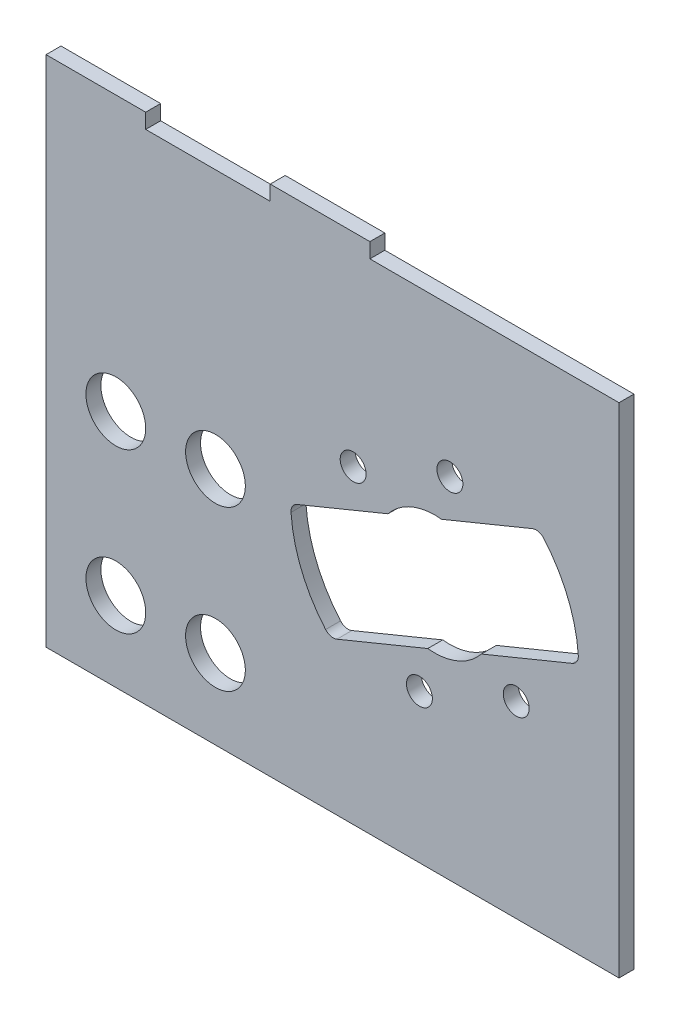
ISO-10303-21;
HEADER;
FILE_DESCRIPTION(('STEP AP214'),'2;1');
FILE_NAME('part.step','',(''),(''),'','','');
FILE_SCHEMA(('AUTOMOTIVE_DESIGN { 1 0 10303 214 1 1 1 1 }'));
ENDSEC;
DATA;
#1=APPLICATION_CONTEXT('core data for automotive mechanical design processes');
#2=APPLICATION_PROTOCOL_DEFINITION('international standard','automotive_design',2000,#1);
#3=PRODUCT_CONTEXT('',#1,'mechanical');
#4=PRODUCT('Part','Part','',(#3));
#5=PRODUCT_RELATED_PRODUCT_CATEGORY('part','',(#4));
#6=PRODUCT_DEFINITION_FORMATION('','',#4);
#7=PRODUCT_DEFINITION_CONTEXT('part definition',#1,'design');
#8=PRODUCT_DEFINITION('design','',#6,#7);
#9=PRODUCT_DEFINITION_SHAPE('','',#8);
#10=(LENGTH_UNIT() NAMED_UNIT(*) SI_UNIT(.MILLI.,.METRE.));
#11=(NAMED_UNIT(*) PLANE_ANGLE_UNIT() SI_UNIT($,.RADIAN.));
#12=(NAMED_UNIT(*) SI_UNIT($,.STERADIAN.) SOLID_ANGLE_UNIT());
#13=UNCERTAINTY_MEASURE_WITH_UNIT(LENGTH_MEASURE(1.E-05),#10,'distance_accuracy_value','');
#14=(GEOMETRIC_REPRESENTATION_CONTEXT(3) GLOBAL_UNCERTAINTY_ASSIGNED_CONTEXT((#13)) GLOBAL_UNIT_ASSIGNED_CONTEXT((#10,
#11,#12)) REPRESENTATION_CONTEXT('',''));
#15=CARTESIAN_POINT('',(0.,0.,0.));
#16=DIRECTION('',(0.,0.,1.));
#17=DIRECTION('',(1.,0.,0.));
#18=AXIS2_PLACEMENT_3D('',#15,#16,#17);
#19=CARTESIAN_POINT('',(0.,0.,0.));
#20=DIRECTION('',(0.,0.,1.));
#21=DIRECTION('',(1.,0.,0.));
#22=AXIS2_PLACEMENT_3D('',#19,#20,#21);
#23=PLANE('',#22);
#24=CARTESIAN_POINT('',(37.8637028586296,-12.1954593498756,0.));
#25=DIRECTION('',(0.,0.,1.));
#26=DIRECTION('',(1.,0.,0.));
#27=AXIS2_PLACEMENT_3D('',#24,#25,#26);
#28=CIRCLE('',#27,2.59999999999996);
#29=CARTESIAN_POINT('',(40.4637028586295,-12.1954593498756,0.));
#30=VERTEX_POINT('',#29);
#31=EDGE_CURVE('E424',#30,#30,#28,.F.);
#32=ORIENTED_EDGE('',*,*,#31,.F.);
#33=EDGE_LOOP('',(#32));
#34=FACE_BOUND('',#33,.T.);
#35=CARTESIAN_POINT('',(18.4398666247588,-20.1776010399089,0.));
#36=DIRECTION('',(0.,0.,1.));
#37=DIRECTION('',(1.,0.,0.));
#38=AXIS2_PLACEMENT_3D('',#35,#36,#37);
#39=CIRCLE('',#38,2.60000000000002);
#40=CARTESIAN_POINT('',(21.0398666247588,-20.1776010399089,0.));
#41=VERTEX_POINT('',#40);
#42=EDGE_CURVE('E421',#41,#41,#39,.F.);
#43=ORIENTED_EDGE('',*,*,#42,.F.);
#44=EDGE_LOOP('',(#43));
#45=FACE_BOUND('',#44,.T.);
#46=CARTESIAN_POINT('',(5.1362971413703,12.195459349876,0.));
#47=DIRECTION('',(0.,0.,1.));
#48=DIRECTION('',(1.,0.,0.));
#49=AXIS2_PLACEMENT_3D('',#46,#47,#48);
#50=CIRCLE('',#49,2.60000000000007);
#51=CARTESIAN_POINT('',(7.73629714137036,12.195459349876,0.));
#52=VERTEX_POINT('',#51);
#53=EDGE_CURVE('E418',#52,#52,#50,.F.);
#54=ORIENTED_EDGE('',*,*,#53,.F.);
#55=EDGE_LOOP('',(#54));
#56=FACE_BOUND('',#55,.T.);
#57=CARTESIAN_POINT('',(24.5601333752411,20.1776010399093,0.));
#58=DIRECTION('',(0.,0.,1.));
#59=DIRECTION('',(1.,0.,0.));
#60=AXIS2_PLACEMENT_3D('',#57,#58,#59);
#61=CIRCLE('',#60,2.59999999999993);
#62=CARTESIAN_POINT('',(27.160133375241,20.1776010399093,0.));
#63=VERTEX_POINT('',#62);
#64=EDGE_CURVE('E415',#63,#63,#61,.F.);
#65=ORIENTED_EDGE('',*,*,#64,.F.);
#66=EDGE_LOOP('',(#65));
#67=FACE_BOUND('',#66,.T.);
#68=CARTESIAN_POINT('',(-42.4960908876632,-2.,0.));
#69=DIRECTION('',(0.,0.,1.));
#70=DIRECTION('',(1.,0.,0.));
#71=AXIS2_PLACEMENT_3D('',#68,#69,#70);
#72=CIRCLE('',#71,5.99999999999999);
#73=CARTESIAN_POINT('',(-36.4960908876632,-2.,0.));
#74=VERTEX_POINT('',#73);
#75=EDGE_CURVE('E467',#74,#74,#72,.T.);
#76=ORIENTED_EDGE('',*,*,#75,.T.);
#77=EDGE_LOOP('',(#76));
#78=FACE_BOUND('',#77,.T.);
#79=CARTESIAN_POINT('',(-22.4960908876632,-34.,0.));
#80=DIRECTION('',(0.,0.,1.));
#81=DIRECTION('',(1.,0.,0.));
#82=AXIS2_PLACEMENT_3D('',#79,#80,#81);
#83=CIRCLE('',#82,5.99999999999999);
#84=CARTESIAN_POINT('',(-16.4960908876632,-34.,0.));
#85=VERTEX_POINT('',#84);
#86=EDGE_CURVE('E474',#85,#85,#83,.T.);
#87=ORIENTED_EDGE('',*,*,#86,.T.);
#88=EDGE_LOOP('',(#87));
#89=FACE_BOUND('',#88,.T.);
#90=CARTESIAN_POINT('',(-22.4960908876632,-2.,0.));
#91=DIRECTION('',(0.,0.,1.));
#92=DIRECTION('',(1.,0.,0.));
#93=AXIS2_PLACEMENT_3D('',#90,#91,#92);
#94=CIRCLE('',#93,5.99999999999999);
#95=CARTESIAN_POINT('',(-16.4960908876632,-2.,0.));
#96=VERTEX_POINT('',#95);
#97=EDGE_CURVE('E461',#96,#96,#94,.T.);
#98=ORIENTED_EDGE('',*,*,#97,.T.);
#99=EDGE_LOOP('',(#98));
#100=FACE_BOUND('',#99,.T.);
#101=CARTESIAN_POINT('',(-42.4960908876632,-34.,0.));
#102=DIRECTION('',(0.,0.,1.));
#103=DIRECTION('',(1.,0.,0.));
#104=AXIS2_PLACEMENT_3D('',#101,#102,#103);
#105=CIRCLE('',#104,5.99999999999999);
#106=CARTESIAN_POINT('',(-36.4960908876632,-34.,0.));
#107=VERTEX_POINT('',#106);
#108=EDGE_CURVE('E479',#107,#107,#105,.T.);
#109=ORIENTED_EDGE('',*,*,#108,.T.);
#110=EDGE_LOOP('',(#109));
#111=FACE_BOUND('',#110,.T.);
#112=DIRECTION('',(0.,1.,0.));
#113=VECTOR('',#112,1.);
#114=CARTESIAN_POINT('',(-36.5,0.,0.));
#115=LINE('',#114,#113);
#116=CARTESIAN_POINT('',(-36.5,50.,0.));
#117=VERTEX_POINT('',#116);
#118=CARTESIAN_POINT('',(-36.5,53.,0.));
#119=VERTEX_POINT('',#118);
#120=EDGE_CURVE('E526',#117,#119,#115,.T.);
#121=ORIENTED_EDGE('',*,*,#120,.F.);
#122=DIRECTION('',(1.,0.,0.));
#123=VECTOR('',#122,1.);
#124=CARTESIAN_POINT('',(0.,50.,0.));
#125=LINE('',#124,#123);
#126=CARTESIAN_POINT('',(-11.5,50.,0.));
#127=VERTEX_POINT('',#126);
#128=EDGE_CURVE('E517',#117,#127,#125,.T.);
#129=ORIENTED_EDGE('',*,*,#128,.T.);
#130=DIRECTION('',(0.,1.,0.));
#131=VECTOR('',#130,1.);
#132=CARTESIAN_POINT('',(-11.5,0.,0.));
#133=LINE('',#132,#131);
#134=CARTESIAN_POINT('',(-11.5,53.,0.));
#135=VERTEX_POINT('',#134);
#136=EDGE_CURVE('E523',#127,#135,#133,.T.);
#137=ORIENTED_EDGE('',*,*,#136,.T.);
#138=DIRECTION('',(1.,0.,0.));
#139=VECTOR('',#138,1.);
#140=CARTESIAN_POINT('',(0.,53.,0.));
#141=LINE('',#140,#139);
#142=CARTESIAN_POINT('',(8.5,53.,0.));
#143=VERTEX_POINT('',#142);
#144=EDGE_CURVE('E520',#135,#143,#141,.T.);
#145=ORIENTED_EDGE('',*,*,#144,.T.);
#146=DIRECTION('',(0.,1.,0.));
#147=VECTOR('',#146,1.);
#148=CARTESIAN_POINT('',(8.5,0.,0.));
#149=LINE('',#148,#147);
#150=CARTESIAN_POINT('',(8.5,50.,0.));
#151=VERTEX_POINT('',#150);
#152=EDGE_CURVE('E516',#151,#143,#149,.T.);
#153=ORIENTED_EDGE('',*,*,#152,.F.);
#154=CARTESIAN_POINT('',(58.5,50.,0.));
#155=VERTEX_POINT('',#154);
#156=EDGE_CURVE('E513',#151,#155,#125,.T.);
#157=ORIENTED_EDGE('',*,*,#156,.T.);
#158=DIRECTION('',(0.,-1.,0.));
#159=VECTOR('',#158,1.);
#160=CARTESIAN_POINT('',(58.5,0.,0.));
#161=LINE('',#160,#159);
#162=CARTESIAN_POINT('',(58.5,-50.,0.));
#163=VERTEX_POINT('',#162);
#164=EDGE_CURVE('E482',#155,#163,#161,.T.);
#165=ORIENTED_EDGE('',*,*,#164,.T.);
#166=DIRECTION('',(1.,0.,0.));
#167=VECTOR('',#166,1.);
#168=CARTESIAN_POINT('',(0.,-50.,0.));
#169=LINE('',#168,#167);
#170=CARTESIAN_POINT('',(-56.5,-50.,0.));
#171=VERTEX_POINT('',#170);
#172=EDGE_CURVE('E489',#171,#163,#169,.T.);
#173=ORIENTED_EDGE('',*,*,#172,.F.);
#174=DIRECTION('',(0.,-1.,0.));
#175=VECTOR('',#174,1.);
#176=CARTESIAN_POINT('',(-56.5,0.,0.));
#177=LINE('',#176,#175);
#178=CARTESIAN_POINT('',(-56.5,53.,0.));
#179=VERTEX_POINT('',#178);
#180=EDGE_CURVE('E532',#179,#171,#177,.T.);
#181=ORIENTED_EDGE('',*,*,#180,.F.);
#182=DIRECTION('',(1.,0.,0.));
#183=VECTOR('',#182,1.);
#184=CARTESIAN_POINT('',(0.,53.,0.));
#185=LINE('',#184,#183);
#186=EDGE_CURVE('E529',#179,#119,#185,.T.);
#187=ORIENTED_EDGE('',*,*,#186,.T.);
#188=EDGE_LOOP('',(#121,#129,#137,#145,#153,#157,#165,#173,#181,#187));
#189=FACE_BOUND('',#188,.T.);
#190=CARTESIAN_POINT('',(21.5,2.32886626649886E-13,0.));
#191=DIRECTION('',(0.,0.,1.));
#192=DIRECTION('',(1.,0.,0.));
#193=AXIS2_PLACEMENT_3D('',#190,#191,#192);
#194=CIRCLE('',#193,28.9);
#195=CARTESIAN_POINT('',(-7.33239795039358,-1.97555775165877,0.));
#196=VERTEX_POINT('',#195);
#197=CARTESIAN_POINT('',(-0.390237900272518,-18.8686905923401,0.));
#198=VERTEX_POINT('',#197);
#199=EDGE_CURVE('E457',#196,#198,#194,.T.);
#200=ORIENTED_EDGE('',*,*,#199,.T.);
#201=CARTESIAN_POINT('',(1.12465745614764,-17.5628988558459,0.));
#202=DIRECTION('',(0.,0.,1.));
#203=DIRECTION('',(1.,0.,0.));
#204=AXIS2_PLACEMENT_3D('',#201,#202,#203);
#205=CIRCLE('',#204,1.99999999999994);
#206=CARTESIAN_POINT('',(1.88486142662657,-19.4127880209766,0.));
#207=VERTEX_POINT('',#206);
#208=EDGE_CURVE('E384',#198,#207,#205,.T.);
#209=ORIENTED_EDGE('',*,*,#208,.T.);
#210=DIRECTION('',(0.924944582565277,0.380101985239679,0.));
#211=VECTOR('',#210,1.);
#212=CARTESIAN_POINT('',(7.09733750745417,-17.2707434664348,0.));
#213=LINE('',#212,#211);
#214=CARTESIAN_POINT('',(20.1176283983561,-11.9201111049758,0.));
#215=VERTEX_POINT('',#214);
#216=EDGE_CURVE('E427',#207,#215,#213,.T.);
#217=ORIENTED_EDGE('',*,*,#216,.T.);
#218=CARTESIAN_POINT('',(21.4999999999997,1.54390389361936E-13,0.));
#219=DIRECTION('',(0.,0.,1.));
#220=DIRECTION('',(1.,0.,0.));
#221=AXIS2_PLACEMENT_3D('',#218,#219,#220);
#222=CIRCLE('',#221,12.0000000000001);
#223=CARTESIAN_POINT('',(30.8645132916765,-7.50372512889485,0.));
#224=VERTEX_POINT('',#223);
#225=EDGE_CURVE('E430',#215,#224,#222,.T.);
#226=ORIENTED_EDGE('',*,*,#225,.T.);
#227=DIRECTION('',(0.924933728322829,0.380128397006632,0.));
#228=VECTOR('',#227,1.);
#229=CARTESIAN_POINT('',(7.09810958811624,-17.2712194539516,0.));
#230=LINE('',#229,#228);
#231=CARTESIAN_POINT('',(49.0970663089691,-0.0105275736827195,0.));
#232=VERTEX_POINT('',#231);
#233=EDGE_CURVE('E433',#224,#232,#230,.T.);
#234=ORIENTED_EDGE('',*,*,#233,.T.);
#235=CARTESIAN_POINT('',(48.3370762929272,1.83884095223646,0.));
#236=DIRECTION('',(0.,0.,1.));
#237=DIRECTION('',(1.,0.,0.));
#238=AXIS2_PLACEMENT_3D('',#235,#236,#237);
#239=CIRCLE('',#238,1.99943711307553);
#240=CARTESIAN_POINT('',(50.3318363801583,1.97551927360984,0.));
#241=VERTEX_POINT('',#240);
#242=EDGE_CURVE('E436',#232,#241,#239,.T.);
#243=ORIENTED_EDGE('',*,*,#242,.T.);
#244=CARTESIAN_POINT('',(21.5000000000002,0.,0.));
#245=DIRECTION('',(0.,0.,1.));
#246=DIRECTION('',(1.,0.,0.));
#247=AXIS2_PLACEMENT_3D('',#244,#245,#246);
#248=CIRCLE('',#247,28.8994371130757);
#249=CARTESIAN_POINT('',(43.3898115428788,18.8683230857932,0.));
#250=VERTEX_POINT('',#249);
#251=EDGE_CURVE('E439',#241,#250,#248,.T.);
#252=ORIENTED_EDGE('',*,*,#251,.T.);
#253=CARTESIAN_POINT('',(41.8753425438525,17.5628988558463,0.));
#254=DIRECTION('',(0.,0.,1.));
#255=DIRECTION('',(1.,0.,0.));
#256=AXIS2_PLACEMENT_3D('',#253,#254,#255);
#257=CIRCLE('',#256,1.99943711307561);
#258=CARTESIAN_POINT('',(41.1049178551466,19.4079448087094,0.));
#259=VERTEX_POINT('',#258);
#260=EDGE_CURVE('E442',#250,#259,#257,.T.);
#261=ORIENTED_EDGE('',*,*,#260,.T.);
#262=DIRECTION('',(-0.925076328027562,-0.379781236138704,0.));
#263=VECTOR('',#262,1.);
#264=CARTESIAN_POINT('',(-0.889809891821143,2.16741110155289,0.));
#265=LINE('',#264,#263);
#266=CARTESIAN_POINT('',(22.8695538799223,11.921590588927,0.));
#267=VERTEX_POINT('',#266);
#268=EDGE_CURVE('E445',#259,#267,#265,.T.);
#269=ORIENTED_EDGE('',*,*,#268,.T.);
#270=CARTESIAN_POINT('',(21.5,0.,0.));
#271=DIRECTION('',(0.,0.,1.));
#272=DIRECTION('',(1.,0.,0.));
#273=AXIS2_PLACEMENT_3D('',#270,#271,#272);
#274=CIRCLE('',#273,12.0000000000002);
#275=CARTESIAN_POINT('',(12.1354867083231,7.50372512889505,0.));
#276=VERTEX_POINT('',#275);
#277=EDGE_CURVE('E448',#267,#276,#274,.T.);
#278=ORIENTED_EDGE('',*,*,#277,.T.);
#279=DIRECTION('',(-0.924944582565282,-0.380101985239668,0.));
#280=VECTOR('',#279,1.);
#281=CARTESIAN_POINT('',(-0.884804182579101,2.15309276743612,0.));
#282=LINE('',#281,#280);
#283=CARTESIAN_POINT('',(-6.09728026340649,0.0110482128944569,0.));
#284=VERTEX_POINT('',#283);
#285=EDGE_CURVE('E451',#276,#284,#282,.T.);
#286=ORIENTED_EDGE('',*,*,#285,.T.);
#287=CARTESIAN_POINT('',(-5.3370762929269,-1.838840952236,0.));
#288=DIRECTION('',(0.,0.,1.));
#289=DIRECTION('',(1.,0.,0.));
#290=AXIS2_PLACEMENT_3D('',#287,#288,#289);
#291=CIRCLE('',#290,1.99999999999999);
#292=EDGE_CURVE('E454',#284,#196,#291,.T.);
#293=ORIENTED_EDGE('',*,*,#292,.T.);
#294=EDGE_LOOP('',(#200,#209,#217,#226,#234,#243,#252,#261,#269,#278,#286,#293));
#295=FACE_BOUND('',#294,.T.);
#296=ADVANCED_FACE('F233',(#34,#45,#56,#67,#78,#89,#100,#111,#189,#295),#23,.F.);
#297=CARTESIAN_POINT('',(0.,0.,3.));
#298=DIRECTION('',(0.,0.,1.));
#299=DIRECTION('',(1.,0.,0.));
#300=AXIS2_PLACEMENT_3D('',#297,#298,#299);
#301=PLANE('',#300);
#302=DIRECTION('',(0.,-1.,0.));
#303=VECTOR('',#302,1.);
#304=CARTESIAN_POINT('',(-56.5,0.,3.));
#305=LINE('',#304,#303);
#306=CARTESIAN_POINT('',(-56.5,53.,3.));
#307=VERTEX_POINT('',#306);
#308=CARTESIAN_POINT('',(-56.5,-50.,3.));
#309=VERTEX_POINT('',#308);
#310=EDGE_CURVE('E506',#307,#309,#305,.T.);
#311=ORIENTED_EDGE('',*,*,#310,.T.);
#312=DIRECTION('',(1.,0.,0.));
#313=VECTOR('',#312,1.);
#314=CARTESIAN_POINT('',(0.,-50.,3.));
#315=LINE('',#314,#313);
#316=CARTESIAN_POINT('',(58.5,-50.,3.));
#317=VERTEX_POINT('',#316);
#318=EDGE_CURVE('E508',#309,#317,#315,.T.);
#319=ORIENTED_EDGE('',*,*,#318,.T.);
#320=DIRECTION('',(0.,-1.,0.));
#321=VECTOR('',#320,1.);
#322=CARTESIAN_POINT('',(58.5,0.,3.));
#323=LINE('',#322,#321);
#324=CARTESIAN_POINT('',(58.5,50.,3.));
#325=VERTEX_POINT('',#324);
#326=EDGE_CURVE('E485',#325,#317,#323,.T.);
#327=ORIENTED_EDGE('',*,*,#326,.F.);
#328=DIRECTION('',(1.,0.,0.));
#329=VECTOR('',#328,1.);
#330=CARTESIAN_POINT('',(0.,50.,3.));
#331=LINE('',#330,#329);
#332=CARTESIAN_POINT('',(8.5,50.,3.));
#333=VERTEX_POINT('',#332);
#334=EDGE_CURVE('E488',#333,#325,#331,.T.);
#335=ORIENTED_EDGE('',*,*,#334,.F.);
#336=DIRECTION('',(0.,1.,0.));
#337=VECTOR('',#336,1.);
#338=CARTESIAN_POINT('',(8.5,0.,3.));
#339=LINE('',#338,#337);
#340=CARTESIAN_POINT('',(8.5,53.,3.));
#341=VERTEX_POINT('',#340);
#342=EDGE_CURVE('E492',#333,#341,#339,.T.);
#343=ORIENTED_EDGE('',*,*,#342,.T.);
#344=DIRECTION('',(1.,0.,0.));
#345=VECTOR('',#344,1.);
#346=CARTESIAN_POINT('',(0.,53.,3.));
#347=LINE('',#346,#345);
#348=CARTESIAN_POINT('',(-11.5,53.,3.));
#349=VERTEX_POINT('',#348);
#350=EDGE_CURVE('E495',#349,#341,#347,.T.);
#351=ORIENTED_EDGE('',*,*,#350,.F.);
#352=DIRECTION('',(0.,1.,0.));
#353=VECTOR('',#352,1.);
#354=CARTESIAN_POINT('',(-11.5,0.,3.));
#355=LINE('',#354,#353);
#356=CARTESIAN_POINT('',(-11.5,50.,3.));
#357=VERTEX_POINT('',#356);
#358=EDGE_CURVE('E498',#357,#349,#355,.T.);
#359=ORIENTED_EDGE('',*,*,#358,.F.);
#360=CARTESIAN_POINT('',(-36.5,50.,3.));
#361=VERTEX_POINT('',#360);
#362=EDGE_CURVE('E493',#361,#357,#331,.T.);
#363=ORIENTED_EDGE('',*,*,#362,.F.);
#364=DIRECTION('',(0.,1.,0.));
#365=VECTOR('',#364,1.);
#366=CARTESIAN_POINT('',(-36.5,0.,3.));
#367=LINE('',#366,#365);
#368=CARTESIAN_POINT('',(-36.5,53.,3.));
#369=VERTEX_POINT('',#368);
#370=EDGE_CURVE('E501',#361,#369,#367,.T.);
#371=ORIENTED_EDGE('',*,*,#370,.T.);
#372=DIRECTION('',(1.,0.,0.));
#373=VECTOR('',#372,1.);
#374=CARTESIAN_POINT('',(0.,53.,3.));
#375=LINE('',#374,#373);
#376=EDGE_CURVE('E503',#307,#369,#375,.T.);
#377=ORIENTED_EDGE('',*,*,#376,.F.);
#378=EDGE_LOOP('',(#311,#319,#327,#335,#343,#351,#359,#363,#371,#377));
#379=FACE_BOUND('',#378,.T.);
#380=CARTESIAN_POINT('',(-42.4960908876632,-34.,3.));
#381=DIRECTION('',(0.,0.,1.));
#382=DIRECTION('',(1.,0.,0.));
#383=AXIS2_PLACEMENT_3D('',#380,#381,#382);
#384=CIRCLE('',#383,5.99999999999999);
#385=CARTESIAN_POINT('',(-36.4960908876632,-34.,3.));
#386=VERTEX_POINT('',#385);
#387=EDGE_CURVE('E470',#386,#386,#384,.T.);
#388=ORIENTED_EDGE('',*,*,#387,.F.);
#389=EDGE_LOOP('',(#388));
#390=FACE_BOUND('',#389,.T.);
#391=CARTESIAN_POINT('',(-22.4960908876632,-2.,3.));
#392=DIRECTION('',(0.,0.,1.));
#393=DIRECTION('',(1.,0.,0.));
#394=AXIS2_PLACEMENT_3D('',#391,#392,#393);
#395=CIRCLE('',#394,5.99999999999999);
#396=CARTESIAN_POINT('',(-16.4960908876632,-2.,3.));
#397=VERTEX_POINT('',#396);
#398=EDGE_CURVE('E460',#397,#397,#395,.T.);
#399=ORIENTED_EDGE('',*,*,#398,.F.);
#400=EDGE_LOOP('',(#399));
#401=FACE_BOUND('',#400,.T.);
#402=CARTESIAN_POINT('',(-22.4960908876632,-34.,3.));
#403=DIRECTION('',(0.,0.,1.));
#404=DIRECTION('',(1.,0.,0.));
#405=AXIS2_PLACEMENT_3D('',#402,#403,#404);
#406=CIRCLE('',#405,5.99999999999999);
#407=CARTESIAN_POINT('',(-16.4960908876632,-34.,3.));
#408=VERTEX_POINT('',#407);
#409=EDGE_CURVE('E464',#408,#408,#406,.T.);
#410=ORIENTED_EDGE('',*,*,#409,.F.);
#411=EDGE_LOOP('',(#410));
#412=FACE_BOUND('',#411,.T.);
#413=CARTESIAN_POINT('',(-42.4960908876632,-2.,3.));
#414=DIRECTION('',(0.,0.,1.));
#415=DIRECTION('',(1.,0.,0.));
#416=AXIS2_PLACEMENT_3D('',#413,#414,#415);
#417=CIRCLE('',#416,5.99999999999999);
#418=CARTESIAN_POINT('',(-36.4960908876632,-2.,3.));
#419=VERTEX_POINT('',#418);
#420=EDGE_CURVE('E471',#419,#419,#417,.T.);
#421=ORIENTED_EDGE('',*,*,#420,.F.);
#422=EDGE_LOOP('',(#421));
#423=FACE_BOUND('',#422,.T.);
#424=CARTESIAN_POINT('',(24.5601333752411,20.1776010399093,3.));
#425=DIRECTION('',(0.,0.,1.));
#426=DIRECTION('',(1.,0.,0.));
#427=AXIS2_PLACEMENT_3D('',#424,#425,#426);
#428=CIRCLE('',#427,2.59999999999993);
#429=CARTESIAN_POINT('',(27.160133375241,20.1776010399093,3.));
#430=VERTEX_POINT('',#429);
#431=EDGE_CURVE('E407',#430,#430,#428,.F.);
#432=ORIENTED_EDGE('',*,*,#431,.T.);
#433=EDGE_LOOP('',(#432));
#434=FACE_BOUND('',#433,.T.);
#435=CARTESIAN_POINT('',(5.1362971413703,12.195459349876,3.));
#436=DIRECTION('',(0.,0.,-1.));
#437=DIRECTION('',(-1.,0.,0.));
#438=AXIS2_PLACEMENT_3D('',#435,#436,#437);
#439=CIRCLE('',#438,2.60000000000007);
#440=CARTESIAN_POINT('',(2.53629714137023,12.195459349876,3.));
#441=VERTEX_POINT('',#440);
#442=EDGE_CURVE('E903',#441,#441,#439,.T.);
#443=ORIENTED_EDGE('',*,*,#442,.T.);
#444=EDGE_LOOP('',(#443));
#445=FACE_BOUND('',#444,.T.);
#446=CARTESIAN_POINT('',(18.4398666247588,-20.1776010399089,3.));
#447=DIRECTION('',(0.,0.,-1.));
#448=DIRECTION('',(-1.,0.,0.));
#449=AXIS2_PLACEMENT_3D('',#446,#447,#448);
#450=CIRCLE('',#449,2.60000000000002);
#451=CARTESIAN_POINT('',(15.8398666247587,-20.1776010399089,3.));
#452=VERTEX_POINT('',#451);
#453=EDGE_CURVE('E388',#452,#452,#450,.T.);
#454=ORIENTED_EDGE('',*,*,#453,.T.);
#455=EDGE_LOOP('',(#454));
#456=FACE_BOUND('',#455,.T.);
#457=CARTESIAN_POINT('',(37.8637028586296,-12.1954593498756,3.));
#458=DIRECTION('',(0.,0.,1.));
#459=DIRECTION('',(1.,0.,0.));
#460=AXIS2_PLACEMENT_3D('',#457,#458,#459);
#461=CIRCLE('',#460,2.59999999999996);
#462=CARTESIAN_POINT('',(40.4637028586295,-12.1954593498756,3.));
#463=VERTEX_POINT('',#462);
#464=EDGE_CURVE('E404',#463,#463,#461,.F.);
#465=ORIENTED_EDGE('',*,*,#464,.T.);
#466=EDGE_LOOP('',(#465));
#467=FACE_BOUND('',#466,.T.);
#468=CARTESIAN_POINT('',(1.12465745614764,-17.5628988558459,3.));
#469=DIRECTION('',(0.,0.,1.));
#470=DIRECTION('',(1.,0.,0.));
#471=AXIS2_PLACEMENT_3D('',#468,#469,#470);
#472=CIRCLE('',#471,1.99999999999994);
#473=CARTESIAN_POINT('',(-0.390237900272518,-18.8686905923401,3.));
#474=VERTEX_POINT('',#473);
#475=CARTESIAN_POINT('',(1.88486142662657,-19.4127880209766,3.));
#476=VERTEX_POINT('',#475);
#477=EDGE_CURVE('E256',#474,#476,#472,.T.);
#478=ORIENTED_EDGE('',*,*,#477,.F.);
#479=CARTESIAN_POINT('',(21.5,2.32886626649886E-13,3.));
#480=DIRECTION('',(0.,0.,1.));
#481=DIRECTION('',(1.,0.,0.));
#482=AXIS2_PLACEMENT_3D('',#479,#480,#481);
#483=CIRCLE('',#482,28.9);
#484=CARTESIAN_POINT('',(-7.33239795039358,-1.97555775165877,3.));
#485=VERTEX_POINT('',#484);
#486=EDGE_CURVE('E391',#485,#474,#483,.T.);
#487=ORIENTED_EDGE('',*,*,#486,.F.);
#488=CARTESIAN_POINT('',(-5.3370762929269,-1.838840952236,3.));
#489=DIRECTION('',(0.,0.,1.));
#490=DIRECTION('',(1.,0.,0.));
#491=AXIS2_PLACEMENT_3D('',#488,#489,#490);
#492=CIRCLE('',#491,1.99999999999999);
#493=CARTESIAN_POINT('',(-6.09728026340649,0.0110482128944569,3.));
#494=VERTEX_POINT('',#493);
#495=EDGE_CURVE('E397',#494,#485,#492,.T.);
#496=ORIENTED_EDGE('',*,*,#495,.F.);
#497=DIRECTION('',(-0.924944582565282,-0.380101985239668,0.));
#498=VECTOR('',#497,1.);
#499=CARTESIAN_POINT('',(12.1354867083231,7.50372512889505,3.));
#500=LINE('',#499,#498);
#501=CARTESIAN_POINT('',(12.1354867083231,7.50372512889505,3.));
#502=VERTEX_POINT('',#501);
#503=EDGE_CURVE('E923',#502,#494,#500,.T.);
#504=ORIENTED_EDGE('',*,*,#503,.F.);
#505=CARTESIAN_POINT('',(21.5,0.,3.));
#506=DIRECTION('',(0.,0.,1.));
#507=DIRECTION('',(1.,0.,0.));
#508=AXIS2_PLACEMENT_3D('',#505,#506,#507);
#509=CIRCLE('',#508,12.0000000000002);
#510=CARTESIAN_POINT('',(22.8695538799223,11.921590588927,3.));
#511=VERTEX_POINT('',#510);
#512=EDGE_CURVE('E926',#511,#502,#509,.T.);
#513=ORIENTED_EDGE('',*,*,#512,.F.);
#514=DIRECTION('',(-0.925076328027562,-0.379781236138704,0.));
#515=VECTOR('',#514,1.);
#516=CARTESIAN_POINT('',(41.1049178551466,19.4079448087094,3.));
#517=LINE('',#516,#515);
#518=CARTESIAN_POINT('',(41.1049178551466,19.4079448087094,3.));
#519=VERTEX_POINT('',#518);
#520=EDGE_CURVE('E929',#519,#511,#517,.T.);
#521=ORIENTED_EDGE('',*,*,#520,.F.);
#522=CARTESIAN_POINT('',(41.8753425438525,17.5628988558463,3.));
#523=DIRECTION('',(0.,0.,1.));
#524=DIRECTION('',(1.,0.,0.));
#525=AXIS2_PLACEMENT_3D('',#522,#523,#524);
#526=CIRCLE('',#525,1.99943711307561);
#527=CARTESIAN_POINT('',(43.3898115428788,18.8683230857932,3.));
#528=VERTEX_POINT('',#527);
#529=EDGE_CURVE('E932',#528,#519,#526,.T.);
#530=ORIENTED_EDGE('',*,*,#529,.F.);
#531=CARTESIAN_POINT('',(21.5000000000002,0.,3.));
#532=DIRECTION('',(0.,0.,1.));
#533=DIRECTION('',(1.,0.,0.));
#534=AXIS2_PLACEMENT_3D('',#531,#532,#533);
#535=CIRCLE('',#534,28.8994371130757);
#536=CARTESIAN_POINT('',(50.3318363801583,1.97551927360984,3.));
#537=VERTEX_POINT('',#536);
#538=EDGE_CURVE('E935',#537,#528,#535,.T.);
#539=ORIENTED_EDGE('',*,*,#538,.F.);
#540=CARTESIAN_POINT('',(48.3370762929272,1.83884095223646,3.));
#541=DIRECTION('',(0.,0.,1.));
#542=DIRECTION('',(1.,0.,0.));
#543=AXIS2_PLACEMENT_3D('',#540,#541,#542);
#544=CIRCLE('',#543,1.99943711307553);
#545=CARTESIAN_POINT('',(49.0970663089691,-0.0105275736827195,3.));
#546=VERTEX_POINT('',#545);
#547=EDGE_CURVE('E938',#546,#537,#544,.T.);
#548=ORIENTED_EDGE('',*,*,#547,.F.);
#549=DIRECTION('',(0.924933728322829,0.380128397006632,0.));
#550=VECTOR('',#549,1.);
#551=CARTESIAN_POINT('',(30.8645132916765,-7.50372512889485,3.));
#552=LINE('',#551,#550);
#553=CARTESIAN_POINT('',(30.8645132916765,-7.50372512889485,3.));
#554=VERTEX_POINT('',#553);
#555=EDGE_CURVE('E941',#554,#546,#552,.T.);
#556=ORIENTED_EDGE('',*,*,#555,.F.);
#557=CARTESIAN_POINT('',(21.4999999999997,1.54390389361936E-13,3.));
#558=DIRECTION('',(0.,0.,1.));
#559=DIRECTION('',(1.,0.,0.));
#560=AXIS2_PLACEMENT_3D('',#557,#558,#559);
#561=CIRCLE('',#560,12.0000000000001);
#562=CARTESIAN_POINT('',(20.1176283983561,-11.9201111049758,3.));
#563=VERTEX_POINT('',#562);
#564=EDGE_CURVE('E409',#563,#554,#561,.T.);
#565=ORIENTED_EDGE('',*,*,#564,.F.);
#566=DIRECTION('',(0.924944582565277,0.380101985239679,0.));
#567=VECTOR('',#566,1.);
#568=CARTESIAN_POINT('',(1.88486142662657,-19.4127880209766,3.));
#569=LINE('',#568,#567);
#570=EDGE_CURVE('E403',#476,#563,#569,.T.);
#571=ORIENTED_EDGE('',*,*,#570,.F.);
#572=EDGE_LOOP('',(#478,#487,#496,#504,#513,#521,#530,#539,#548,#556,#565,#571));
#573=FACE_BOUND('',#572,.T.);
#574=ADVANCED_FACE('F401',(#379,#390,#401,#412,#423,#434,#445,#456,#467,#573),#301,.T.);
#575=CARTESIAN_POINT('',(-56.5,0.,3.));
#576=DIRECTION('',(1.,0.,0.));
#577=DIRECTION('',(0.,1.,0.));
#578=AXIS2_PLACEMENT_3D('',#575,#576,#577);
#579=PLANE('',#578);
#580=ORIENTED_EDGE('',*,*,#180,.T.);
#581=DIRECTION('',(0.,0.,-1.));
#582=VECTOR('',#581,1.);
#583=CARTESIAN_POINT('',(-56.5,-50.,3.));
#584=LINE('',#583,#582);
#585=EDGE_CURVE('E537',#309,#171,#584,.T.);
#586=ORIENTED_EDGE('',*,*,#585,.F.);
#587=ORIENTED_EDGE('',*,*,#310,.F.);
#588=DIRECTION('',(0.,0.,-1.));
#589=VECTOR('',#588,1.);
#590=CARTESIAN_POINT('',(-56.5,53.,3.));
#591=LINE('',#590,#589);
#592=EDGE_CURVE('E540',#307,#179,#591,.T.);
#593=ORIENTED_EDGE('',*,*,#592,.T.);
#594=EDGE_LOOP('',(#580,#586,#587,#593));
#595=FACE_BOUND('',#594,.T.);
#596=ADVANCED_FACE('F577',(#595),#579,.F.);
#597=CARTESIAN_POINT('',(0.,53.,3.));
#598=DIRECTION('',(0.,1.,0.));
#599=DIRECTION('',(0.,0.,1.));
#600=AXIS2_PLACEMENT_3D('',#597,#598,#599);
#601=PLANE('',#600);
#602=ORIENTED_EDGE('',*,*,#186,.F.);
#603=ORIENTED_EDGE('',*,*,#592,.F.);
#604=ORIENTED_EDGE('',*,*,#376,.T.);
#605=DIRECTION('',(0.,0.,-1.));
#606=VECTOR('',#605,1.);
#607=CARTESIAN_POINT('',(-36.5,53.,3.));
#608=LINE('',#607,#606);
#609=EDGE_CURVE('E542',#369,#119,#608,.T.);
#610=ORIENTED_EDGE('',*,*,#609,.T.);
#611=EDGE_LOOP('',(#602,#603,#604,#610));
#612=FACE_BOUND('',#611,.T.);
#613=ADVANCED_FACE('F580',(#612),#601,.T.);
#614=CARTESIAN_POINT('',(-36.5,0.,3.));
#615=DIRECTION('',(-1.,0.,0.));
#616=DIRECTION('',(0.,0.,1.));
#617=AXIS2_PLACEMENT_3D('',#614,#615,#616);
#618=PLANE('',#617);
#619=ORIENTED_EDGE('',*,*,#120,.T.);
#620=ORIENTED_EDGE('',*,*,#609,.F.);
#621=ORIENTED_EDGE('',*,*,#370,.F.);
#622=DIRECTION('',(0.,0.,-1.));
#623=VECTOR('',#622,1.);
#624=CARTESIAN_POINT('',(-36.5,50.,3.));
#625=LINE('',#624,#623);
#626=EDGE_CURVE('E544',#361,#117,#625,.T.);
#627=ORIENTED_EDGE('',*,*,#626,.T.);
#628=EDGE_LOOP('',(#619,#620,#621,#627));
#629=FACE_BOUND('',#628,.T.);
#630=ADVANCED_FACE('F599',(#629),#618,.F.);
#631=CARTESIAN_POINT('',(0.,-50.,3.));
#632=DIRECTION('',(0.,1.,0.));
#633=DIRECTION('',(0.,0.,1.));
#634=AXIS2_PLACEMENT_3D('',#631,#632,#633);
#635=PLANE('',#634);
#636=ORIENTED_EDGE('',*,*,#172,.T.);
#637=DIRECTION('',(0.,0.,-1.));
#638=VECTOR('',#637,1.);
#639=CARTESIAN_POINT('',(58.5,-50.,3.));
#640=LINE('',#639,#638);
#641=EDGE_CURVE('E510',#317,#163,#640,.T.);
#642=ORIENTED_EDGE('',*,*,#641,.F.);
#643=ORIENTED_EDGE('',*,*,#318,.F.);
#644=ORIENTED_EDGE('',*,*,#585,.T.);
#645=EDGE_LOOP('',(#636,#642,#643,#644));
#646=FACE_BOUND('',#645,.T.);
#647=ADVANCED_FACE('F572',(#646),#635,.F.);
#648=CARTESIAN_POINT('',(58.5,0.,3.));
#649=DIRECTION('',(1.,0.,0.));
#650=DIRECTION('',(0.,1.,0.));
#651=AXIS2_PLACEMENT_3D('',#648,#649,#650);
#652=PLANE('',#651);
#653=ORIENTED_EDGE('',*,*,#164,.F.);
#654=DIRECTION('',(0.,0.,-1.));
#655=VECTOR('',#654,1.);
#656=CARTESIAN_POINT('',(58.5,50.,3.));
#657=LINE('',#656,#655);
#658=EDGE_CURVE('E12',#325,#155,#657,.T.);
#659=ORIENTED_EDGE('',*,*,#658,.F.);
#660=ORIENTED_EDGE('',*,*,#326,.T.);
#661=ORIENTED_EDGE('',*,*,#641,.T.);
#662=EDGE_LOOP('',(#653,#659,#660,#661));
#663=FACE_BOUND('',#662,.T.);
#664=ADVANCED_FACE('F235',(#663),#652,.T.);
#665=CARTESIAN_POINT('',(0.,50.,3.));
#666=DIRECTION('',(0.,1.,0.));
#667=DIRECTION('',(0.,0.,1.));
#668=AXIS2_PLACEMENT_3D('',#665,#666,#667);
#669=PLANE('',#668);
#670=ORIENTED_EDGE('',*,*,#156,.F.);
#671=DIRECTION('',(0.,0.,-1.));
#672=VECTOR('',#671,1.);
#673=CARTESIAN_POINT('',(8.5,50.,3.));
#674=LINE('',#673,#672);
#675=EDGE_CURVE('E241',#333,#151,#674,.T.);
#676=ORIENTED_EDGE('',*,*,#675,.F.);
#677=ORIENTED_EDGE('',*,*,#334,.T.);
#678=ORIENTED_EDGE('',*,*,#658,.T.);
#679=EDGE_LOOP('',(#670,#676,#677,#678));
#680=FACE_BOUND('',#679,.T.);
#681=ADVANCED_FACE('F563',(#680),#669,.T.);
#682=CARTESIAN_POINT('',(8.5,0.,3.));
#683=DIRECTION('',(-1.,0.,0.));
#684=DIRECTION('',(0.,0.,1.));
#685=AXIS2_PLACEMENT_3D('',#682,#683,#684);
#686=PLANE('',#685);
#687=ORIENTED_EDGE('',*,*,#152,.T.);
#688=DIRECTION('',(0.,0.,-1.));
#689=VECTOR('',#688,1.);
#690=CARTESIAN_POINT('',(8.5,53.,3.));
#691=LINE('',#690,#689);
#692=EDGE_CURVE('E550',#341,#143,#691,.T.);
#693=ORIENTED_EDGE('',*,*,#692,.F.);
#694=ORIENTED_EDGE('',*,*,#342,.F.);
#695=ORIENTED_EDGE('',*,*,#675,.T.);
#696=EDGE_LOOP('',(#687,#693,#694,#695));
#697=FACE_BOUND('',#696,.T.);
#698=ADVANCED_FACE('F554',(#697),#686,.F.);
#699=CARTESIAN_POINT('',(0.,53.,3.));
#700=DIRECTION('',(0.,1.,0.));
#701=DIRECTION('',(0.,0.,1.));
#702=AXIS2_PLACEMENT_3D('',#699,#700,#701);
#703=PLANE('',#702);
#704=ORIENTED_EDGE('',*,*,#144,.F.);
#705=DIRECTION('',(0.,0.,-1.));
#706=VECTOR('',#705,1.);
#707=CARTESIAN_POINT('',(-11.5,53.,3.));
#708=LINE('',#707,#706);
#709=EDGE_CURVE('E548',#349,#135,#708,.T.);
#710=ORIENTED_EDGE('',*,*,#709,.F.);
#711=ORIENTED_EDGE('',*,*,#350,.T.);
#712=ORIENTED_EDGE('',*,*,#692,.T.);
#713=EDGE_LOOP('',(#704,#710,#711,#712));
#714=FACE_BOUND('',#713,.T.);
#715=ADVANCED_FACE('F596',(#714),#703,.T.);
#716=CARTESIAN_POINT('',(-11.5,0.,3.));
#717=DIRECTION('',(-1.,0.,0.));
#718=DIRECTION('',(0.,0.,1.));
#719=AXIS2_PLACEMENT_3D('',#716,#717,#718);
#720=PLANE('',#719);
#721=ORIENTED_EDGE('',*,*,#136,.F.);
#722=DIRECTION('',(0.,0.,-1.));
#723=VECTOR('',#722,1.);
#724=CARTESIAN_POINT('',(-11.5,50.,3.));
#725=LINE('',#724,#723);
#726=EDGE_CURVE('E546',#357,#127,#725,.T.);
#727=ORIENTED_EDGE('',*,*,#726,.F.);
#728=ORIENTED_EDGE('',*,*,#358,.T.);
#729=ORIENTED_EDGE('',*,*,#709,.T.);
#730=EDGE_LOOP('',(#721,#727,#728,#729));
#731=FACE_BOUND('',#730,.T.);
#732=ADVANCED_FACE('F593',(#731),#720,.T.);
#733=ORIENTED_EDGE('',*,*,#128,.F.);
#734=ORIENTED_EDGE('',*,*,#626,.F.);
#735=ORIENTED_EDGE('',*,*,#362,.T.);
#736=ORIENTED_EDGE('',*,*,#726,.T.);
#737=EDGE_LOOP('',(#733,#734,#735,#736));
#738=FACE_BOUND('',#737,.T.);
#739=ADVANCED_FACE('F586',(#738),#669,.T.);
#740=CARTESIAN_POINT('',(-42.4960908876632,-34.,0.));
#741=DIRECTION('',(0.,0.,1.));
#742=DIRECTION('',(1.,0.,0.));
#743=AXIS2_PLACEMENT_3D('',#740,#741,#742);
#744=CYLINDRICAL_SURFACE('',#743,5.99999999999999);
#745=ORIENTED_EDGE('',*,*,#108,.F.);
#746=EDGE_LOOP('',(#745));
#747=FACE_BOUND('',#746,.T.);
#748=ORIENTED_EDGE('',*,*,#387,.T.);
#749=EDGE_LOOP('',(#748));
#750=FACE_BOUND('',#749,.T.);
#751=ADVANCED_FACE('F690',(#747,#750),#744,.F.);
#752=CARTESIAN_POINT('',(-22.4960908876632,-2.,0.));
#753=DIRECTION('',(0.,0.,1.));
#754=DIRECTION('',(1.,0.,0.));
#755=AXIS2_PLACEMENT_3D('',#752,#753,#754);
#756=CYLINDRICAL_SURFACE('',#755,5.99999999999999);
#757=ORIENTED_EDGE('',*,*,#97,.F.);
#758=EDGE_LOOP('',(#757));
#759=FACE_BOUND('',#758,.T.);
#760=ORIENTED_EDGE('',*,*,#398,.T.);
#761=EDGE_LOOP('',(#760));
#762=FACE_BOUND('',#761,.T.);
#763=ADVANCED_FACE('F699',(#759,#762),#756,.F.);
#764=CARTESIAN_POINT('',(-22.4960908876632,-34.,0.));
#765=DIRECTION('',(0.,0.,1.));
#766=DIRECTION('',(1.,0.,0.));
#767=AXIS2_PLACEMENT_3D('',#764,#765,#766);
#768=CYLINDRICAL_SURFACE('',#767,5.99999999999999);
#769=ORIENTED_EDGE('',*,*,#86,.F.);
#770=EDGE_LOOP('',(#769));
#771=FACE_BOUND('',#770,.T.);
#772=ORIENTED_EDGE('',*,*,#409,.T.);
#773=EDGE_LOOP('',(#772));
#774=FACE_BOUND('',#773,.T.);
#775=ADVANCED_FACE('F708',(#771,#774),#768,.F.);
#776=CARTESIAN_POINT('',(-42.4960908876632,-2.,0.));
#777=DIRECTION('',(0.,0.,1.));
#778=DIRECTION('',(1.,0.,0.));
#779=AXIS2_PLACEMENT_3D('',#776,#777,#778);
#780=CYLINDRICAL_SURFACE('',#779,5.99999999999999);
#781=ORIENTED_EDGE('',*,*,#75,.F.);
#782=EDGE_LOOP('',(#781));
#783=FACE_BOUND('',#782,.T.);
#784=ORIENTED_EDGE('',*,*,#420,.T.);
#785=EDGE_LOOP('',(#784));
#786=FACE_BOUND('',#785,.T.);
#787=ADVANCED_FACE('F718',(#783,#786),#780,.F.);
#788=CARTESIAN_POINT('',(24.5601333752411,20.1776010399093,-7.));
#789=DIRECTION('',(0.,0.,1.));
#790=DIRECTION('',(1.,0.,0.));
#791=AXIS2_PLACEMENT_3D('',#788,#789,#790);
#792=CYLINDRICAL_SURFACE('',#791,2.59999999999993);
#793=ORIENTED_EDGE('',*,*,#431,.F.);
#794=EDGE_LOOP('',(#793));
#795=FACE_BOUND('',#794,.T.);
#796=ORIENTED_EDGE('',*,*,#64,.T.);
#797=EDGE_LOOP('',(#796));
#798=FACE_BOUND('',#797,.T.);
#799=ADVANCED_FACE('F727',(#795,#798),#792,.F.);
#800=CARTESIAN_POINT('',(5.1362971413703,12.195459349876,-7.));
#801=DIRECTION('',(0.,0.,1.));
#802=DIRECTION('',(1.,0.,0.));
#803=AXIS2_PLACEMENT_3D('',#800,#801,#802);
#804=CYLINDRICAL_SURFACE('',#803,2.60000000000007);
#805=ORIENTED_EDGE('',*,*,#442,.F.);
#806=EDGE_LOOP('',(#805));
#807=FACE_BOUND('',#806,.T.);
#808=ORIENTED_EDGE('',*,*,#53,.T.);
#809=EDGE_LOOP('',(#808));
#810=FACE_BOUND('',#809,.T.);
#811=ADVANCED_FACE('F750',(#807,#810),#804,.F.);
#812=CARTESIAN_POINT('',(18.4398666247588,-20.1776010399089,-7.));
#813=DIRECTION('',(0.,0.,1.));
#814=DIRECTION('',(1.,0.,0.));
#815=AXIS2_PLACEMENT_3D('',#812,#813,#814);
#816=CYLINDRICAL_SURFACE('',#815,2.60000000000002);
#817=ORIENTED_EDGE('',*,*,#453,.F.);
#818=EDGE_LOOP('',(#817));
#819=FACE_BOUND('',#818,.T.);
#820=ORIENTED_EDGE('',*,*,#42,.T.);
#821=EDGE_LOOP('',(#820));
#822=FACE_BOUND('',#821,.T.);
#823=ADVANCED_FACE('F760',(#819,#822),#816,.F.);
#824=CARTESIAN_POINT('',(37.8637028586296,-12.1954593498756,-7.));
#825=DIRECTION('',(0.,0.,1.));
#826=DIRECTION('',(1.,0.,0.));
#827=AXIS2_PLACEMENT_3D('',#824,#825,#826);
#828=CYLINDRICAL_SURFACE('',#827,2.59999999999996);
#829=ORIENTED_EDGE('',*,*,#464,.F.);
#830=EDGE_LOOP('',(#829));
#831=FACE_BOUND('',#830,.T.);
#832=ORIENTED_EDGE('',*,*,#31,.T.);
#833=EDGE_LOOP('',(#832));
#834=FACE_BOUND('',#833,.T.);
#835=ADVANCED_FACE('F770',(#831,#834),#828,.F.);
#836=CARTESIAN_POINT('',(1.12465745614764,-17.5628988558459,-7.));
#837=DIRECTION('',(0.,0.,1.));
#838=DIRECTION('',(1.,0.,0.));
#839=AXIS2_PLACEMENT_3D('',#836,#837,#838);
#840=CYLINDRICAL_SURFACE('',#839,1.99999999999994);
#841=DIRECTION('',(0.,0.,1.));
#842=VECTOR('',#841,1.);
#843=CARTESIAN_POINT('',(-0.390237900272518,-18.8686905923401,-7.));
#844=LINE('',#843,#842);
#845=EDGE_CURVE('E380',#198,#474,#844,.T.);
#846=ORIENTED_EDGE('',*,*,#845,.T.);
#847=ORIENTED_EDGE('',*,*,#477,.T.);
#848=DIRECTION('',(0.,0.,1.));
#849=VECTOR('',#848,1.);
#850=CARTESIAN_POINT('',(1.88486142662657,-19.4127880209766,-7.));
#851=LINE('',#850,#849);
#852=EDGE_CURVE('E398',#207,#476,#851,.T.);
#853=ORIENTED_EDGE('',*,*,#852,.F.);
#854=ORIENTED_EDGE('',*,*,#208,.F.);
#855=EDGE_LOOP('',(#846,#847,#853,#854));
#856=FACE_BOUND('',#855,.T.);
#857=ADVANCED_FACE('F382',(#856),#840,.F.);
#858=CARTESIAN_POINT('',(21.5,2.32886626649886E-13,-7.));
#859=DIRECTION('',(0.,0.,1.));
#860=DIRECTION('',(1.,0.,0.));
#861=AXIS2_PLACEMENT_3D('',#858,#859,#860);
#862=CYLINDRICAL_SURFACE('',#861,28.9);
#863=DIRECTION('',(0.,0.,1.));
#864=VECTOR('',#863,1.);
#865=CARTESIAN_POINT('',(-7.33239795039358,-1.97555775165877,-7.));
#866=LINE('',#865,#864);
#867=EDGE_CURVE('E387',#196,#485,#866,.T.);
#868=ORIENTED_EDGE('',*,*,#867,.T.);
#869=ORIENTED_EDGE('',*,*,#486,.T.);
#870=ORIENTED_EDGE('',*,*,#845,.F.);
#871=ORIENTED_EDGE('',*,*,#199,.F.);
#872=EDGE_LOOP('',(#868,#869,#870,#871));
#873=FACE_BOUND('',#872,.T.);
#874=ADVANCED_FACE('F392',(#873),#862,.F.);
#875=CARTESIAN_POINT('',(-5.3370762929269,-1.838840952236,-7.));
#876=DIRECTION('',(0.,0.,1.));
#877=DIRECTION('',(1.,0.,0.));
#878=AXIS2_PLACEMENT_3D('',#875,#876,#877);
#879=CYLINDRICAL_SURFACE('',#878,1.99999999999999);
#880=DIRECTION('',(0.,0.,1.));
#881=VECTOR('',#880,1.);
#882=CARTESIAN_POINT('',(-6.09728026340649,0.0110482128944569,-7.));
#883=LINE('',#882,#881);
#884=EDGE_CURVE('E919',#284,#494,#883,.T.);
#885=ORIENTED_EDGE('',*,*,#884,.T.);
#886=ORIENTED_EDGE('',*,*,#495,.T.);
#887=ORIENTED_EDGE('',*,*,#867,.F.);
#888=ORIENTED_EDGE('',*,*,#292,.F.);
#889=EDGE_LOOP('',(#885,#886,#887,#888));
#890=FACE_BOUND('',#889,.T.);
#891=ADVANCED_FACE('F797',(#890),#879,.F.);
#892=CARTESIAN_POINT('',(12.1354867083231,7.50372512889505,-7.));
#893=DIRECTION('',(-0.380101985239668,0.924944582565282,0.));
#894=DIRECTION('',(-0.924944582565282,-0.380101985239668,0.));
#895=AXIS2_PLACEMENT_3D('',#892,#893,#894);
#896=PLANE('',#895);
#897=DIRECTION('',(0.,0.,1.));
#898=VECTOR('',#897,1.);
#899=CARTESIAN_POINT('',(12.1354867083231,7.50372512889505,-7.));
#900=LINE('',#899,#898);
#901=EDGE_CURVE('E917',#276,#502,#900,.T.);
#902=ORIENTED_EDGE('',*,*,#901,.T.);
#903=ORIENTED_EDGE('',*,*,#503,.T.);
#904=ORIENTED_EDGE('',*,*,#884,.F.);
#905=ORIENTED_EDGE('',*,*,#285,.F.);
#906=EDGE_LOOP('',(#902,#903,#904,#905));
#907=FACE_BOUND('',#906,.T.);
#908=ADVANCED_FACE('F806',(#907),#896,.F.);
#909=CARTESIAN_POINT('',(21.5,0.,-7.));
#910=DIRECTION('',(0.,0.,1.));
#911=DIRECTION('',(1.,0.,0.));
#912=AXIS2_PLACEMENT_3D('',#909,#910,#911);
#913=CYLINDRICAL_SURFACE('',#912,12.0000000000002);
#914=DIRECTION('',(0.,0.,1.));
#915=VECTOR('',#914,1.);
#916=CARTESIAN_POINT('',(22.8695538799223,11.921590588927,-7.));
#917=LINE('',#916,#915);
#918=EDGE_CURVE('E915',#267,#511,#917,.T.);
#919=ORIENTED_EDGE('',*,*,#918,.T.);
#920=ORIENTED_EDGE('',*,*,#512,.T.);
#921=ORIENTED_EDGE('',*,*,#901,.F.);
#922=ORIENTED_EDGE('',*,*,#277,.F.);
#923=EDGE_LOOP('',(#919,#920,#921,#922));
#924=FACE_BOUND('',#923,.T.);
#925=ADVANCED_FACE('F816',(#924),#913,.F.);
#926=CARTESIAN_POINT('',(41.1049178551466,19.4079448087094,-7.));
#927=DIRECTION('',(-0.379781236138704,0.925076328027562,0.));
#928=DIRECTION('',(-0.925076328027562,-0.379781236138704,0.));
#929=AXIS2_PLACEMENT_3D('',#926,#927,#928);
#930=PLANE('',#929);
#931=DIRECTION('',(0.,0.,1.));
#932=VECTOR('',#931,1.);
#933=CARTESIAN_POINT('',(41.1049178551466,19.4079448087094,-7.));
#934=LINE('',#933,#932);
#935=EDGE_CURVE('E913',#259,#519,#934,.T.);
#936=ORIENTED_EDGE('',*,*,#935,.T.);
#937=ORIENTED_EDGE('',*,*,#520,.T.);
#938=ORIENTED_EDGE('',*,*,#918,.F.);
#939=ORIENTED_EDGE('',*,*,#268,.F.);
#940=EDGE_LOOP('',(#936,#937,#938,#939));
#941=FACE_BOUND('',#940,.T.);
#942=ADVANCED_FACE('F826',(#941),#930,.F.);
#943=CARTESIAN_POINT('',(41.8753425438525,17.5628988558463,-7.));
#944=DIRECTION('',(0.,0.,1.));
#945=DIRECTION('',(1.,0.,0.));
#946=AXIS2_PLACEMENT_3D('',#943,#944,#945);
#947=CYLINDRICAL_SURFACE('',#946,1.99943711307561);
#948=DIRECTION('',(0.,0.,1.));
#949=VECTOR('',#948,1.);
#950=CARTESIAN_POINT('',(43.3898115428788,18.8683230857932,-7.));
#951=LINE('',#950,#949);
#952=EDGE_CURVE('E911',#250,#528,#951,.T.);
#953=ORIENTED_EDGE('',*,*,#952,.T.);
#954=ORIENTED_EDGE('',*,*,#529,.T.);
#955=ORIENTED_EDGE('',*,*,#935,.F.);
#956=ORIENTED_EDGE('',*,*,#260,.F.);
#957=EDGE_LOOP('',(#953,#954,#955,#956));
#958=FACE_BOUND('',#957,.T.);
#959=ADVANCED_FACE('F836',(#958),#947,.F.);
#960=CARTESIAN_POINT('',(21.5000000000002,0.,-7.));
#961=DIRECTION('',(0.,0.,1.));
#962=DIRECTION('',(1.,0.,0.));
#963=AXIS2_PLACEMENT_3D('',#960,#961,#962);
#964=CYLINDRICAL_SURFACE('',#963,28.8994371130757);
#965=DIRECTION('',(0.,0.,1.));
#966=VECTOR('',#965,1.);
#967=CARTESIAN_POINT('',(50.3318363801583,1.97551927360984,-7.));
#968=LINE('',#967,#966);
#969=EDGE_CURVE('E909',#241,#537,#968,.T.);
#970=ORIENTED_EDGE('',*,*,#969,.T.);
#971=ORIENTED_EDGE('',*,*,#538,.T.);
#972=ORIENTED_EDGE('',*,*,#952,.F.);
#973=ORIENTED_EDGE('',*,*,#251,.F.);
#974=EDGE_LOOP('',(#970,#971,#972,#973));
#975=FACE_BOUND('',#974,.T.);
#976=ADVANCED_FACE('F846',(#975),#964,.F.);
#977=CARTESIAN_POINT('',(48.3370762929272,1.83884095223646,-7.));
#978=DIRECTION('',(0.,0.,1.));
#979=DIRECTION('',(1.,0.,0.));
#980=AXIS2_PLACEMENT_3D('',#977,#978,#979);
#981=CYLINDRICAL_SURFACE('',#980,1.99943711307553);
#982=DIRECTION('',(0.,0.,1.));
#983=VECTOR('',#982,1.);
#984=CARTESIAN_POINT('',(49.0970663089691,-0.0105275736827195,-7.));
#985=LINE('',#984,#983);
#986=EDGE_CURVE('E907',#232,#546,#985,.T.);
#987=ORIENTED_EDGE('',*,*,#986,.T.);
#988=ORIENTED_EDGE('',*,*,#547,.T.);
#989=ORIENTED_EDGE('',*,*,#969,.F.);
#990=ORIENTED_EDGE('',*,*,#242,.F.);
#991=EDGE_LOOP('',(#987,#988,#989,#990));
#992=FACE_BOUND('',#991,.T.);
#993=ADVANCED_FACE('F856',(#992),#981,.F.);
#994=CARTESIAN_POINT('',(30.8645132916765,-7.50372512889485,-7.));
#995=DIRECTION('',(0.380128397006632,-0.924933728322829,0.));
#996=DIRECTION('',(0.924933728322829,0.380128397006632,0.));
#997=AXIS2_PLACEMENT_3D('',#994,#995,#996);
#998=PLANE('',#997);
#999=DIRECTION('',(0.,0.,1.));
#1000=VECTOR('',#999,1.);
#1001=CARTESIAN_POINT('',(30.8645132916765,-7.50372512889485,-7.));
#1002=LINE('',#1001,#1000);
#1003=EDGE_CURVE('E900',#224,#554,#1002,.T.);
#1004=ORIENTED_EDGE('',*,*,#1003,.T.);
#1005=ORIENTED_EDGE('',*,*,#555,.T.);
#1006=ORIENTED_EDGE('',*,*,#986,.F.);
#1007=ORIENTED_EDGE('',*,*,#233,.F.);
#1008=EDGE_LOOP('',(#1004,#1005,#1006,#1007));
#1009=FACE_BOUND('',#1008,.T.);
#1010=ADVANCED_FACE('F866',(#1009),#998,.F.);
#1011=CARTESIAN_POINT('',(21.4999999999997,1.54390389361936E-13,-7.));
#1012=DIRECTION('',(0.,0.,1.));
#1013=DIRECTION('',(1.,0.,0.));
#1014=AXIS2_PLACEMENT_3D('',#1011,#1012,#1013);
#1015=CYLINDRICAL_SURFACE('',#1014,12.0000000000001);
#1016=DIRECTION('',(0.,0.,1.));
#1017=VECTOR('',#1016,1.);
#1018=CARTESIAN_POINT('',(20.1176283983561,-11.9201111049758,-7.));
#1019=LINE('',#1018,#1017);
#1020=EDGE_CURVE('E248',#215,#563,#1019,.T.);
#1021=ORIENTED_EDGE('',*,*,#1020,.T.);
#1022=ORIENTED_EDGE('',*,*,#564,.T.);
#1023=ORIENTED_EDGE('',*,*,#1003,.F.);
#1024=ORIENTED_EDGE('',*,*,#225,.F.);
#1025=EDGE_LOOP('',(#1021,#1022,#1023,#1024));
#1026=FACE_BOUND('',#1025,.T.);
#1027=ADVANCED_FACE('F876',(#1026),#1015,.F.);
#1028=CARTESIAN_POINT('',(1.88486142662657,-19.4127880209766,-7.));
#1029=DIRECTION('',(0.380101985239679,-0.924944582565277,0.));
#1030=DIRECTION('',(0.924944582565277,0.380101985239679,0.));
#1031=AXIS2_PLACEMENT_3D('',#1028,#1029,#1030);
#1032=PLANE('',#1031);
#1033=ORIENTED_EDGE('',*,*,#852,.T.);
#1034=ORIENTED_EDGE('',*,*,#570,.T.);
#1035=ORIENTED_EDGE('',*,*,#1020,.F.);
#1036=ORIENTED_EDGE('',*,*,#216,.F.);
#1037=EDGE_LOOP('',(#1033,#1034,#1035,#1036));
#1038=FACE_BOUND('',#1037,.T.);
#1039=ADVANCED_FACE('F886',(#1038),#1032,.F.);
#1040=CLOSED_SHELL('',(#296,#574,#596,#613,#630,#647,#664,#681,#698,#715,#732,#739,#751,#763,
#775,#787,#799,#811,#823,#835,#857,#874,#891,#908,#925,#942,#959,#976,#993,#1010,#1027,#1039));
#1041=MANIFOLD_SOLID_BREP('B2',#1040);
#1042=ADVANCED_BREP_SHAPE_REPRESENTATION('',(#18,#1041),#14);
#1043=SHAPE_DEFINITION_REPRESENTATION(#9,#1042);
ENDSEC;
END-ISO-10303-21;
